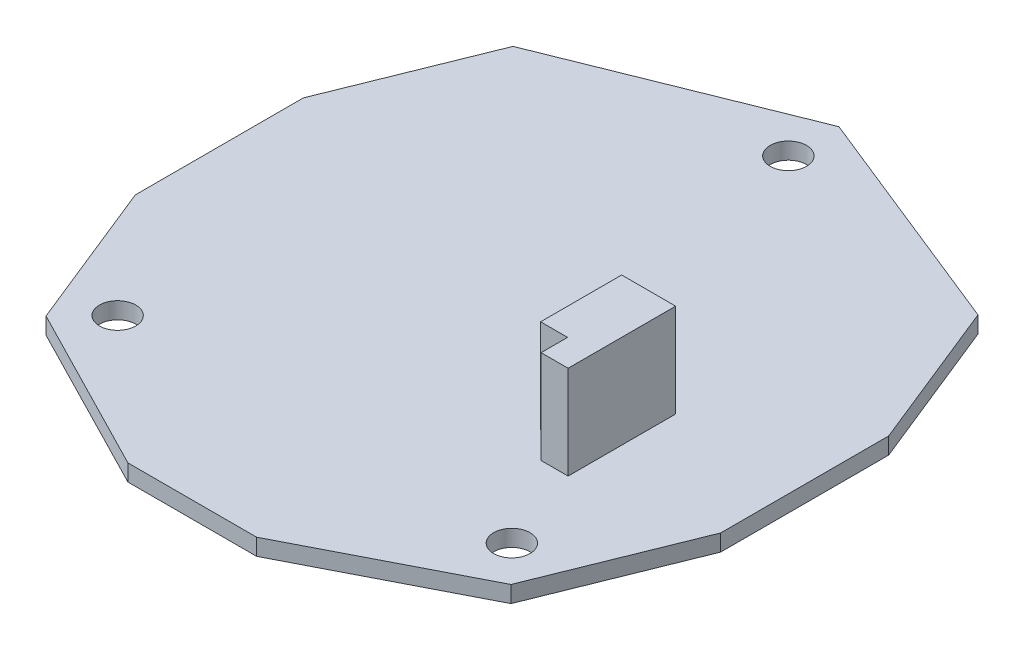
ISO-10303-21;
HEADER;
FILE_DESCRIPTION(('STEP AP214'),'2;1');
FILE_NAME('part.step','',(''),(''),'','','');
FILE_SCHEMA(('AUTOMOTIVE_DESIGN { 1 0 10303 214 1 1 1 1 }'));
ENDSEC;
DATA;
#1=APPLICATION_CONTEXT('core data for automotive mechanical design processes');
#2=APPLICATION_PROTOCOL_DEFINITION('international standard','automotive_design',2000,#1);
#3=PRODUCT_CONTEXT('',#1,'mechanical');
#4=PRODUCT('Part','Part','',(#3));
#5=PRODUCT_RELATED_PRODUCT_CATEGORY('part','',(#4));
#6=PRODUCT_DEFINITION_FORMATION('','',#4);
#7=PRODUCT_DEFINITION_CONTEXT('part definition',#1,'design');
#8=PRODUCT_DEFINITION('design','',#6,#7);
#9=PRODUCT_DEFINITION_SHAPE('','',#8);
#10=(LENGTH_UNIT() NAMED_UNIT(*) SI_UNIT(.MILLI.,.METRE.));
#11=(NAMED_UNIT(*) PLANE_ANGLE_UNIT() SI_UNIT($,.RADIAN.));
#12=(NAMED_UNIT(*) SI_UNIT($,.STERADIAN.) SOLID_ANGLE_UNIT());
#13=UNCERTAINTY_MEASURE_WITH_UNIT(LENGTH_MEASURE(1.E-05),#10,'distance_accuracy_value','');
#14=(GEOMETRIC_REPRESENTATION_CONTEXT(3) GLOBAL_UNCERTAINTY_ASSIGNED_CONTEXT((#13)) GLOBAL_UNIT_ASSIGNED_CONTEXT((#10,
#11,#12)) REPRESENTATION_CONTEXT('',''));
#15=CARTESIAN_POINT('',(0.,0.,0.));
#16=DIRECTION('',(0.,0.,1.));
#17=DIRECTION('',(1.,0.,0.));
#18=AXIS2_PLACEMENT_3D('',#15,#16,#17);
#19=CARTESIAN_POINT('',(0.,1.6,0.));
#20=DIRECTION('',(0.,-1.,0.));
#21=DIRECTION('',(0.,0.,-1.));
#22=AXIS2_PLACEMENT_3D('',#19,#20,#21);
#23=PLANE('',#22);
#24=DIRECTION('',(-0.373610843312482,0.,0.927585542017197));
#25=VECTOR('',#24,1.);
#26=CARTESIAN_POINT('',(-28.2,1.6,-7.74999999999999));
#27=LINE('',#26,#25);
#28=CARTESIAN_POINT('',(-22.4,1.6,-22.15));
#29=VERTEX_POINT('',#28);
#30=CARTESIAN_POINT('',(-28.2,1.6,-7.74999999999999));
#31=VERTEX_POINT('',#30);
#32=EDGE_CURVE('E196',#29,#31,#27,.T.);
#33=ORIENTED_EDGE('',*,*,#32,.T.);
#34=DIRECTION('',(0.,0.,1.));
#35=VECTOR('',#34,1.);
#36=CARTESIAN_POINT('',(-28.2,1.6,8.44000000000001));
#37=LINE('',#36,#35);
#38=CARTESIAN_POINT('',(-28.2,1.6,8.44000000000001));
#39=VERTEX_POINT('',#38);
#40=EDGE_CURVE('E199',#31,#39,#37,.T.);
#41=ORIENTED_EDGE('',*,*,#40,.T.);
#42=DIRECTION('',(0.373610843312482,0.,0.927585542017197));
#43=VECTOR('',#42,1.);
#44=CARTESIAN_POINT('',(-22.4,1.6,22.84));
#45=LINE('',#44,#43);
#46=CARTESIAN_POINT('',(-22.4,1.6,22.84));
#47=VERTEX_POINT('',#46);
#48=EDGE_CURVE('E202',#39,#47,#45,.T.);
#49=ORIENTED_EDGE('',*,*,#48,.T.);
#50=DIRECTION('',(0.889765992870365,0.,0.456417000046464));
#51=VECTOR('',#50,1.);
#52=CARTESIAN_POINT('',(-6.2,1.6,31.15));
#53=LINE('',#52,#51);
#54=CARTESIAN_POINT('',(-6.2,1.6,31.15));
#55=VERTEX_POINT('',#54);
#56=EDGE_CURVE('E204',#47,#55,#53,.T.);
#57=ORIENTED_EDGE('',*,*,#56,.T.);
#58=DIRECTION('',(1.,0.,0.));
#59=VECTOR('',#58,1.);
#60=CARTESIAN_POINT('',(6.2,1.6,31.15));
#61=LINE('',#60,#59);
#62=CARTESIAN_POINT('',(6.2,1.6,31.15));
#63=VERTEX_POINT('',#62);
#64=EDGE_CURVE('E206',#55,#63,#61,.T.);
#65=ORIENTED_EDGE('',*,*,#64,.T.);
#66=DIRECTION('',(0.889765992870365,0.,-0.456417000046464));
#67=VECTOR('',#66,1.);
#68=CARTESIAN_POINT('',(22.4,1.6,22.84));
#69=LINE('',#68,#67);
#70=CARTESIAN_POINT('',(22.4,1.6,22.84));
#71=VERTEX_POINT('',#70);
#72=EDGE_CURVE('E208',#63,#71,#69,.T.);
#73=ORIENTED_EDGE('',*,*,#72,.T.);
#74=DIRECTION('',(0.373610843312482,0.,-0.927585542017196));
#75=VECTOR('',#74,1.);
#76=CARTESIAN_POINT('',(28.2,1.6,8.44000000000001));
#77=LINE('',#76,#75);
#78=CARTESIAN_POINT('',(28.2,1.6,8.44000000000001));
#79=VERTEX_POINT('',#78);
#80=EDGE_CURVE('E210',#71,#79,#77,.T.);
#81=ORIENTED_EDGE('',*,*,#80,.T.);
#82=DIRECTION('',(0.,0.,-1.));
#83=VECTOR('',#82,1.);
#84=CARTESIAN_POINT('',(28.2,1.6,-7.74999999999999));
#85=LINE('',#84,#83);
#86=CARTESIAN_POINT('',(28.2,1.6,-7.74999999999999));
#87=VERTEX_POINT('',#86);
#88=EDGE_CURVE('E212',#79,#87,#85,.T.);
#89=ORIENTED_EDGE('',*,*,#88,.T.);
#90=DIRECTION('',(-0.373610843312482,0.,-0.927585542017197));
#91=VECTOR('',#90,1.);
#92=CARTESIAN_POINT('',(22.4,1.6,-22.15));
#93=LINE('',#92,#91);
#94=CARTESIAN_POINT('',(22.4,1.6,-22.15));
#95=VERTEX_POINT('',#94);
#96=EDGE_CURVE('E214',#87,#95,#93,.T.);
#97=ORIENTED_EDGE('',*,*,#96,.T.);
#98=DIRECTION('',(-0.927904222503089,0.,-0.372818660827134));
#99=VECTOR('',#98,1.);
#100=CARTESIAN_POINT('',(0.,1.6,-31.15));
#101=LINE('',#100,#99);
#102=CARTESIAN_POINT('',(0.,1.6,-31.15));
#103=VERTEX_POINT('',#102);
#104=EDGE_CURVE('E216',#95,#103,#101,.T.);
#105=ORIENTED_EDGE('',*,*,#104,.T.);
#106=DIRECTION('',(-0.927904222503089,0.,0.372818660827134));
#107=VECTOR('',#106,1.);
#108=CARTESIAN_POINT('',(-22.4,1.6,-22.15));
#109=LINE('',#108,#107);
#110=EDGE_CURVE('E218',#103,#29,#109,.T.);
#111=ORIENTED_EDGE('',*,*,#110,.T.);
#112=EDGE_LOOP('',(#33,#41,#49,#57,#65,#73,#81,#89,#97,#105,#111));
#113=FACE_BOUND('',#112,.T.);
#114=CARTESIAN_POINT('',(0.,1.6,-26.28));
#115=DIRECTION('',(0.,1.,0.));
#116=DIRECTION('',(0.,0.,1.));
#117=AXIS2_PLACEMENT_3D('',#114,#115,#116);
#118=CIRCLE('',#117,1.75);
#119=CARTESIAN_POINT('',(0.,1.6,-24.53));
#120=VERTEX_POINT('',#119);
#121=EDGE_CURVE('E187',#120,#120,#118,.T.);
#122=ORIENTED_EDGE('',*,*,#121,.F.);
#123=EDGE_LOOP('',(#122));
#124=FACE_BOUND('',#123,.T.);
#125=CARTESIAN_POINT('',(18.99,1.6,19.35));
#126=DIRECTION('',(0.,1.,0.));
#127=DIRECTION('',(0.,0.,1.));
#128=AXIS2_PLACEMENT_3D('',#125,#126,#127);
#129=CIRCLE('',#128,1.75);
#130=CARTESIAN_POINT('',(18.99,1.6,21.1));
#131=VERTEX_POINT('',#130);
#132=EDGE_CURVE('E182',#131,#131,#129,.T.);
#133=ORIENTED_EDGE('',*,*,#132,.F.);
#134=EDGE_LOOP('',(#133));
#135=FACE_BOUND('',#134,.T.);
#136=CARTESIAN_POINT('',(-18.99,1.6,19.35));
#137=DIRECTION('',(0.,1.,0.));
#138=DIRECTION('',(0.,0.,-1.));
#139=AXIS2_PLACEMENT_3D('',#136,#137,#138);
#140=CIRCLE('',#139,1.75);
#141=CARTESIAN_POINT('',(-18.99,1.6,17.6));
#142=VERTEX_POINT('',#141);
#143=EDGE_CURVE('E172',#142,#142,#140,.T.);
#144=ORIENTED_EDGE('',*,*,#143,.F.);
#145=EDGE_LOOP('',(#144));
#146=FACE_BOUND('',#145,.T.);
#147=DIRECTION('',(0.,0.,-1.));
#148=VECTOR('',#147,1.);
#149=CARTESIAN_POINT('',(16.11,1.6,11.05));
#150=LINE('',#149,#148);
#151=CARTESIAN_POINT('',(16.11,1.6,11.05));
#152=VERTEX_POINT('',#151);
#153=CARTESIAN_POINT('',(16.11,1.6,0.690000000000004));
#154=VERTEX_POINT('',#153);
#155=EDGE_CURVE('E171',#152,#154,#150,.T.);
#156=ORIENTED_EDGE('',*,*,#155,.F.);
#157=DIRECTION('',(1.,0.,0.));
#158=VECTOR('',#157,1.);
#159=CARTESIAN_POINT('',(16.11,1.6,11.05));
#160=LINE('',#159,#158);
#161=CARTESIAN_POINT('',(13.51,1.6,11.05));
#162=VERTEX_POINT('',#161);
#163=EDGE_CURVE('E168',#162,#152,#160,.T.);
#164=ORIENTED_EDGE('',*,*,#163,.F.);
#165=DIRECTION('',(0.,0.,1.));
#166=VECTOR('',#165,1.);
#167=CARTESIAN_POINT('',(13.51,1.6,8.5));
#168=LINE('',#167,#166);
#169=CARTESIAN_POINT('',(13.51,1.6,8.5));
#170=VERTEX_POINT('',#169);
#171=EDGE_CURVE('E530',#170,#162,#168,.T.);
#172=ORIENTED_EDGE('',*,*,#171,.F.);
#173=DIRECTION('',(1.,0.,0.));
#174=VECTOR('',#173,1.);
#175=CARTESIAN_POINT('',(13.51,1.6,8.5));
#176=LINE('',#175,#174);
#177=CARTESIAN_POINT('',(10.91,1.6,8.5));
#178=VERTEX_POINT('',#177);
#179=EDGE_CURVE('E545',#178,#170,#176,.T.);
#180=ORIENTED_EDGE('',*,*,#179,.F.);
#181=DIRECTION('',(0.,0.,1.));
#182=VECTOR('',#181,1.);
#183=CARTESIAN_POINT('',(10.91,1.6,0.690000000000005));
#184=LINE('',#183,#182);
#185=CARTESIAN_POINT('',(10.91,1.6,0.690000000000005));
#186=VERTEX_POINT('',#185);
#187=EDGE_CURVE('E52',#186,#178,#184,.T.);
#188=ORIENTED_EDGE('',*,*,#187,.F.);
#189=DIRECTION('',(-1.,0.,0.));
#190=VECTOR('',#189,1.);
#191=CARTESIAN_POINT('',(13.51,1.6,0.690000000000005));
#192=LINE('',#191,#190);
#193=EDGE_CURVE('E47',#154,#186,#192,.T.);
#194=ORIENTED_EDGE('',*,*,#193,.F.);
#195=EDGE_LOOP('',(#156,#164,#172,#180,#188,#194));
#196=FACE_BOUND('',#195,.T.);
#197=ADVANCED_FACE('F32',(#113,#124,#135,#146,#196),#23,.F.);
#198=CARTESIAN_POINT('',(-28.2,1.6,-7.74999999999999));
#199=DIRECTION('',(0.927585542017197,0.,0.373610843312482));
#200=DIRECTION('',(0.373610843312482,0.,-0.927585542017197));
#201=AXIS2_PLACEMENT_3D('',#198,#199,#200);
#202=PLANE('',#201);
#203=DIRECTION('',(-0.373610843312482,0.,0.927585542017197));
#204=VECTOR('',#203,1.);
#205=CARTESIAN_POINT('',(-28.2,0.,-7.74999999999999));
#206=LINE('',#205,#204);
#207=CARTESIAN_POINT('',(-22.4,0.,-22.15));
#208=VERTEX_POINT('',#207);
#209=CARTESIAN_POINT('',(-28.2,0.,-7.74999999999999));
#210=VERTEX_POINT('',#209);
#211=EDGE_CURVE('E193',#208,#210,#206,.T.);
#212=ORIENTED_EDGE('',*,*,#211,.T.);
#213=DIRECTION('',(0.,-1.,0.));
#214=VECTOR('',#213,1.);
#215=CARTESIAN_POINT('',(-28.2,1.6,-7.74999999999999));
#216=LINE('',#215,#214);
#217=EDGE_CURVE('E11',#31,#210,#216,.T.);
#218=ORIENTED_EDGE('',*,*,#217,.F.);
#219=ORIENTED_EDGE('',*,*,#32,.F.);
#220=DIRECTION('',(0.,-1.,0.));
#221=VECTOR('',#220,1.);
#222=CARTESIAN_POINT('',(-22.4,1.6,-22.15));
#223=LINE('',#222,#221);
#224=EDGE_CURVE('E220',#29,#208,#223,.T.);
#225=ORIENTED_EDGE('',*,*,#224,.T.);
#226=EDGE_LOOP('',(#212,#218,#219,#225));
#227=FACE_BOUND('',#226,.T.);
#228=ADVANCED_FACE('F34',(#227),#202,.F.);
#229=CARTESIAN_POINT('',(-28.2,1.6,8.44000000000001));
#230=DIRECTION('',(1.,0.,0.));
#231=DIRECTION('',(0.,0.,-1.));
#232=AXIS2_PLACEMENT_3D('',#229,#230,#231);
#233=PLANE('',#232);
#234=DIRECTION('',(0.,0.,1.));
#235=VECTOR('',#234,1.);
#236=CARTESIAN_POINT('',(-28.2,0.,8.44000000000001));
#237=LINE('',#236,#235);
#238=CARTESIAN_POINT('',(-28.2,0.,8.44000000000001));
#239=VERTEX_POINT('',#238);
#240=EDGE_CURVE('E223',#210,#239,#237,.T.);
#241=ORIENTED_EDGE('',*,*,#240,.T.);
#242=DIRECTION('',(0.,-1.,0.));
#243=VECTOR('',#242,1.);
#244=CARTESIAN_POINT('',(-28.2,1.6,8.44000000000001));
#245=LINE('',#244,#243);
#246=EDGE_CURVE('E40',#39,#239,#245,.T.);
#247=ORIENTED_EDGE('',*,*,#246,.F.);
#248=ORIENTED_EDGE('',*,*,#40,.F.);
#249=ORIENTED_EDGE('',*,*,#217,.T.);
#250=EDGE_LOOP('',(#241,#247,#248,#249));
#251=FACE_BOUND('',#250,.T.);
#252=ADVANCED_FACE('F295',(#251),#233,.F.);
#253=CARTESIAN_POINT('',(-22.4,1.6,22.84));
#254=DIRECTION('',(0.927585542017197,0.,-0.373610843312482));
#255=DIRECTION('',(-0.373610843312482,0.,-0.927585542017197));
#256=AXIS2_PLACEMENT_3D('',#253,#254,#255);
#257=PLANE('',#256);
#258=DIRECTION('',(0.373610843312482,0.,0.927585542017197));
#259=VECTOR('',#258,1.);
#260=CARTESIAN_POINT('',(-22.4,0.,22.84));
#261=LINE('',#260,#259);
#262=CARTESIAN_POINT('',(-22.4,0.,22.84));
#263=VERTEX_POINT('',#262);
#264=EDGE_CURVE('E225',#239,#263,#261,.T.);
#265=ORIENTED_EDGE('',*,*,#264,.T.);
#266=DIRECTION('',(0.,-1.,0.));
#267=VECTOR('',#266,1.);
#268=CARTESIAN_POINT('',(-22.4,1.6,22.84));
#269=LINE('',#268,#267);
#270=EDGE_CURVE('E265',#47,#263,#269,.T.);
#271=ORIENTED_EDGE('',*,*,#270,.F.);
#272=ORIENTED_EDGE('',*,*,#48,.F.);
#273=ORIENTED_EDGE('',*,*,#246,.T.);
#274=EDGE_LOOP('',(#265,#271,#272,#273));
#275=FACE_BOUND('',#274,.T.);
#276=ADVANCED_FACE('F272',(#275),#257,.F.);
#277=CARTESIAN_POINT('',(-6.2,1.6,31.15));
#278=DIRECTION('',(0.456417000046464,0.,-0.889765992870365));
#279=DIRECTION('',(-0.889765992870365,0.,-0.456417000046464));
#280=AXIS2_PLACEMENT_3D('',#277,#278,#279);
#281=PLANE('',#280);
#282=DIRECTION('',(0.889765992870365,0.,0.456417000046464));
#283=VECTOR('',#282,1.);
#284=CARTESIAN_POINT('',(-6.2,0.,31.15));
#285=LINE('',#284,#283);
#286=CARTESIAN_POINT('',(-6.2,0.,31.15));
#287=VERTEX_POINT('',#286);
#288=EDGE_CURVE('E227',#263,#287,#285,.T.);
#289=ORIENTED_EDGE('',*,*,#288,.T.);
#290=DIRECTION('',(0.,-1.,0.));
#291=VECTOR('',#290,1.);
#292=CARTESIAN_POINT('',(-6.2,1.6,31.15));
#293=LINE('',#292,#291);
#294=EDGE_CURVE('E262',#55,#287,#293,.T.);
#295=ORIENTED_EDGE('',*,*,#294,.F.);
#296=ORIENTED_EDGE('',*,*,#56,.F.);
#297=ORIENTED_EDGE('',*,*,#270,.T.);
#298=EDGE_LOOP('',(#289,#295,#296,#297));
#299=FACE_BOUND('',#298,.T.);
#300=ADVANCED_FACE('F283',(#299),#281,.F.);
#301=CARTESIAN_POINT('',(6.2,1.6,31.15));
#302=DIRECTION('',(0.,0.,-1.));
#303=DIRECTION('',(-1.,0.,0.));
#304=AXIS2_PLACEMENT_3D('',#301,#302,#303);
#305=PLANE('',#304);
#306=DIRECTION('',(1.,0.,0.));
#307=VECTOR('',#306,1.);
#308=CARTESIAN_POINT('',(6.2,0.,31.15));
#309=LINE('',#308,#307);
#310=CARTESIAN_POINT('',(6.2,0.,31.15));
#311=VERTEX_POINT('',#310);
#312=EDGE_CURVE('E229',#287,#311,#309,.T.);
#313=ORIENTED_EDGE('',*,*,#312,.T.);
#314=DIRECTION('',(0.,-1.,0.));
#315=VECTOR('',#314,1.);
#316=CARTESIAN_POINT('',(6.2,1.6,31.15));
#317=LINE('',#316,#315);
#318=EDGE_CURVE('E259',#63,#311,#317,.T.);
#319=ORIENTED_EDGE('',*,*,#318,.F.);
#320=ORIENTED_EDGE('',*,*,#64,.F.);
#321=ORIENTED_EDGE('',*,*,#294,.T.);
#322=EDGE_LOOP('',(#313,#319,#320,#321));
#323=FACE_BOUND('',#322,.T.);
#324=ADVANCED_FACE('F287',(#323),#305,.F.);
#325=CARTESIAN_POINT('',(22.4,1.6,22.84));
#326=DIRECTION('',(-0.456417000046465,0.,-0.889765992870365));
#327=DIRECTION('',(-0.889765992870365,0.,0.456417000046465));
#328=AXIS2_PLACEMENT_3D('',#325,#326,#327);
#329=PLANE('',#328);
#330=DIRECTION('',(0.889765992870365,0.,-0.456417000046464));
#331=VECTOR('',#330,1.);
#332=CARTESIAN_POINT('',(22.4,0.,22.84));
#333=LINE('',#332,#331);
#334=CARTESIAN_POINT('',(22.4,0.,22.84));
#335=VERTEX_POINT('',#334);
#336=EDGE_CURVE('E231',#311,#335,#333,.T.);
#337=ORIENTED_EDGE('',*,*,#336,.T.);
#338=DIRECTION('',(0.,-1.,0.));
#339=VECTOR('',#338,1.);
#340=CARTESIAN_POINT('',(22.4,1.6,22.84));
#341=LINE('',#340,#339);
#342=EDGE_CURVE('E256',#71,#335,#341,.T.);
#343=ORIENTED_EDGE('',*,*,#342,.F.);
#344=ORIENTED_EDGE('',*,*,#72,.F.);
#345=ORIENTED_EDGE('',*,*,#318,.T.);
#346=EDGE_LOOP('',(#337,#343,#344,#345));
#347=FACE_BOUND('',#346,.T.);
#348=ADVANCED_FACE('F323',(#347),#329,.F.);
#349=CARTESIAN_POINT('',(28.2,1.6,8.44000000000001));
#350=DIRECTION('',(-0.927585542017196,0.,-0.373610843312482));
#351=DIRECTION('',(-0.373610843312482,0.,0.927585542017196));
#352=AXIS2_PLACEMENT_3D('',#349,#350,#351);
#353=PLANE('',#352);
#354=DIRECTION('',(0.373610843312482,0.,-0.927585542017196));
#355=VECTOR('',#354,1.);
#356=CARTESIAN_POINT('',(28.2,0.,8.44000000000001));
#357=LINE('',#356,#355);
#358=CARTESIAN_POINT('',(28.2,0.,8.44000000000001));
#359=VERTEX_POINT('',#358);
#360=EDGE_CURVE('E233',#335,#359,#357,.T.);
#361=ORIENTED_EDGE('',*,*,#360,.T.);
#362=DIRECTION('',(0.,-1.,0.));
#363=VECTOR('',#362,1.);
#364=CARTESIAN_POINT('',(28.2,1.6,8.44000000000001));
#365=LINE('',#364,#363);
#366=EDGE_CURVE('E253',#79,#359,#365,.T.);
#367=ORIENTED_EDGE('',*,*,#366,.F.);
#368=ORIENTED_EDGE('',*,*,#80,.F.);
#369=ORIENTED_EDGE('',*,*,#342,.T.);
#370=EDGE_LOOP('',(#361,#367,#368,#369));
#371=FACE_BOUND('',#370,.T.);
#372=ADVANCED_FACE('F321',(#371),#353,.F.);
#373=CARTESIAN_POINT('',(28.2,1.6,-7.74999999999999));
#374=DIRECTION('',(-1.,0.,0.));
#375=DIRECTION('',(0.,0.,1.));
#376=AXIS2_PLACEMENT_3D('',#373,#374,#375);
#377=PLANE('',#376);
#378=DIRECTION('',(0.,0.,-1.));
#379=VECTOR('',#378,1.);
#380=CARTESIAN_POINT('',(28.2,0.,-7.74999999999999));
#381=LINE('',#380,#379);
#382=CARTESIAN_POINT('',(28.2,0.,-7.74999999999999));
#383=VERTEX_POINT('',#382);
#384=EDGE_CURVE('E235',#359,#383,#381,.T.);
#385=ORIENTED_EDGE('',*,*,#384,.T.);
#386=DIRECTION('',(0.,-1.,0.));
#387=VECTOR('',#386,1.);
#388=CARTESIAN_POINT('',(28.2,1.6,-7.74999999999999));
#389=LINE('',#388,#387);
#390=EDGE_CURVE('E250',#87,#383,#389,.T.);
#391=ORIENTED_EDGE('',*,*,#390,.F.);
#392=ORIENTED_EDGE('',*,*,#88,.F.);
#393=ORIENTED_EDGE('',*,*,#366,.T.);
#394=EDGE_LOOP('',(#385,#391,#392,#393));
#395=FACE_BOUND('',#394,.T.);
#396=ADVANCED_FACE('F316',(#395),#377,.F.);
#397=CARTESIAN_POINT('',(22.4,1.6,-22.15));
#398=DIRECTION('',(-0.927585542017197,0.,0.373610843312482));
#399=DIRECTION('',(0.373610843312482,0.,0.927585542017197));
#400=AXIS2_PLACEMENT_3D('',#397,#398,#399);
#401=PLANE('',#400);
#402=DIRECTION('',(-0.373610843312482,0.,-0.927585542017197));
#403=VECTOR('',#402,1.);
#404=CARTESIAN_POINT('',(22.4,0.,-22.15));
#405=LINE('',#404,#403);
#406=CARTESIAN_POINT('',(22.4,0.,-22.15));
#407=VERTEX_POINT('',#406);
#408=EDGE_CURVE('E237',#383,#407,#405,.T.);
#409=ORIENTED_EDGE('',*,*,#408,.T.);
#410=DIRECTION('',(0.,-1.,0.));
#411=VECTOR('',#410,1.);
#412=CARTESIAN_POINT('',(22.4,1.6,-22.15));
#413=LINE('',#412,#411);
#414=EDGE_CURVE('E247',#95,#407,#413,.T.);
#415=ORIENTED_EDGE('',*,*,#414,.F.);
#416=ORIENTED_EDGE('',*,*,#96,.F.);
#417=ORIENTED_EDGE('',*,*,#390,.T.);
#418=EDGE_LOOP('',(#409,#415,#416,#417));
#419=FACE_BOUND('',#418,.T.);
#420=ADVANCED_FACE('F311',(#419),#401,.F.);
#421=CARTESIAN_POINT('',(0.,1.6,-31.15));
#422=DIRECTION('',(-0.372818660827134,0.,0.927904222503089));
#423=DIRECTION('',(0.927904222503089,0.,0.372818660827134));
#424=AXIS2_PLACEMENT_3D('',#421,#422,#423);
#425=PLANE('',#424);
#426=DIRECTION('',(-0.927904222503089,0.,-0.372818660827134));
#427=VECTOR('',#426,1.);
#428=CARTESIAN_POINT('',(0.,0.,-31.15));
#429=LINE('',#428,#427);
#430=CARTESIAN_POINT('',(0.,0.,-31.15));
#431=VERTEX_POINT('',#430);
#432=EDGE_CURVE('E239',#407,#431,#429,.T.);
#433=ORIENTED_EDGE('',*,*,#432,.T.);
#434=DIRECTION('',(0.,-1.,0.));
#435=VECTOR('',#434,1.);
#436=CARTESIAN_POINT('',(0.,1.6,-31.15));
#437=LINE('',#436,#435);
#438=EDGE_CURVE('E244',#103,#431,#437,.T.);
#439=ORIENTED_EDGE('',*,*,#438,.F.);
#440=ORIENTED_EDGE('',*,*,#104,.F.);
#441=ORIENTED_EDGE('',*,*,#414,.T.);
#442=EDGE_LOOP('',(#433,#439,#440,#441));
#443=FACE_BOUND('',#442,.T.);
#444=ADVANCED_FACE('F307',(#443),#425,.F.);
#445=CARTESIAN_POINT('',(-22.4,1.6,-22.15));
#446=DIRECTION('',(0.372818660827134,0.,0.927904222503089));
#447=DIRECTION('',(0.927904222503089,0.,-0.372818660827134));
#448=AXIS2_PLACEMENT_3D('',#445,#446,#447);
#449=PLANE('',#448);
#450=DIRECTION('',(-0.927904222503089,0.,0.372818660827134));
#451=VECTOR('',#450,1.);
#452=CARTESIAN_POINT('',(-22.4,0.,-22.15));
#453=LINE('',#452,#451);
#454=EDGE_CURVE('E200',#431,#208,#453,.T.);
#455=ORIENTED_EDGE('',*,*,#454,.T.);
#456=ORIENTED_EDGE('',*,*,#224,.F.);
#457=ORIENTED_EDGE('',*,*,#110,.F.);
#458=ORIENTED_EDGE('',*,*,#438,.T.);
#459=EDGE_LOOP('',(#455,#456,#457,#458));
#460=FACE_BOUND('',#459,.T.);
#461=ADVANCED_FACE('F302',(#460),#449,.F.);
#462=CARTESIAN_POINT('',(0.,0.,0.));
#463=DIRECTION('',(0.,-1.,0.));
#464=DIRECTION('',(0.,0.,-1.));
#465=AXIS2_PLACEMENT_3D('',#462,#463,#464);
#466=PLANE('',#465);
#467=CARTESIAN_POINT('',(-18.99,0.,19.35));
#468=DIRECTION('',(0.,1.,0.));
#469=DIRECTION('',(0.,0.,-1.));
#470=AXIS2_PLACEMENT_3D('',#467,#468,#469);
#471=CIRCLE('',#470,1.75);
#472=CARTESIAN_POINT('',(-18.99,0.,17.6));
#473=VERTEX_POINT('',#472);
#474=EDGE_CURVE('E175',#473,#473,#471,.T.);
#475=ORIENTED_EDGE('',*,*,#474,.T.);
#476=EDGE_LOOP('',(#475));
#477=FACE_BOUND('',#476,.T.);
#478=CARTESIAN_POINT('',(18.99,0.,19.35));
#479=DIRECTION('',(0.,1.,0.));
#480=DIRECTION('',(0.,0.,1.));
#481=AXIS2_PLACEMENT_3D('',#478,#479,#480);
#482=CIRCLE('',#481,1.75);
#483=CARTESIAN_POINT('',(18.99,0.,21.1));
#484=VERTEX_POINT('',#483);
#485=EDGE_CURVE('E184',#484,#484,#482,.T.);
#486=ORIENTED_EDGE('',*,*,#485,.T.);
#487=EDGE_LOOP('',(#486));
#488=FACE_BOUND('',#487,.T.);
#489=CARTESIAN_POINT('',(0.,0.,-26.28));
#490=DIRECTION('',(0.,1.,0.));
#491=DIRECTION('',(0.,0.,1.));
#492=AXIS2_PLACEMENT_3D('',#489,#490,#491);
#493=CIRCLE('',#492,1.75);
#494=CARTESIAN_POINT('',(0.,0.,-24.53));
#495=VERTEX_POINT('',#494);
#496=EDGE_CURVE('E190',#495,#495,#493,.T.);
#497=ORIENTED_EDGE('',*,*,#496,.T.);
#498=EDGE_LOOP('',(#497));
#499=FACE_BOUND('',#498,.T.);
#500=ORIENTED_EDGE('',*,*,#211,.F.);
#501=ORIENTED_EDGE('',*,*,#454,.F.);
#502=ORIENTED_EDGE('',*,*,#432,.F.);
#503=ORIENTED_EDGE('',*,*,#408,.F.);
#504=ORIENTED_EDGE('',*,*,#384,.F.);
#505=ORIENTED_EDGE('',*,*,#360,.F.);
#506=ORIENTED_EDGE('',*,*,#336,.F.);
#507=ORIENTED_EDGE('',*,*,#312,.F.);
#508=ORIENTED_EDGE('',*,*,#288,.F.);
#509=ORIENTED_EDGE('',*,*,#264,.F.);
#510=ORIENTED_EDGE('',*,*,#240,.F.);
#511=EDGE_LOOP('',(#500,#501,#502,#503,#504,#505,#506,#507,#508,#509,#510));
#512=FACE_BOUND('',#511,.T.);
#513=ADVANCED_FACE('F278',(#477,#488,#499,#512),#466,.T.);
#514=CARTESIAN_POINT('',(0.,0.,-26.28));
#515=DIRECTION('',(0.,1.,0.));
#516=DIRECTION('',(0.,0.,1.));
#517=AXIS2_PLACEMENT_3D('',#514,#515,#516);
#518=CYLINDRICAL_SURFACE('',#517,1.75);
#519=ORIENTED_EDGE('',*,*,#496,.F.);
#520=EDGE_LOOP('',(#519));
#521=FACE_BOUND('',#520,.T.);
#522=ORIENTED_EDGE('',*,*,#121,.T.);
#523=EDGE_LOOP('',(#522));
#524=FACE_BOUND('',#523,.T.);
#525=ADVANCED_FACE('F339',(#521,#524),#518,.F.);
#526=CARTESIAN_POINT('',(18.99,0.,19.35));
#527=DIRECTION('',(0.,1.,0.));
#528=DIRECTION('',(0.,0.,1.));
#529=AXIS2_PLACEMENT_3D('',#526,#527,#528);
#530=CYLINDRICAL_SURFACE('',#529,1.75);
#531=ORIENTED_EDGE('',*,*,#485,.F.);
#532=EDGE_LOOP('',(#531));
#533=FACE_BOUND('',#532,.T.);
#534=ORIENTED_EDGE('',*,*,#132,.T.);
#535=EDGE_LOOP('',(#534));
#536=FACE_BOUND('',#535,.T.);
#537=ADVANCED_FACE('F377',(#533,#536),#530,.F.);
#538=CARTESIAN_POINT('',(-18.99,0.,19.35));
#539=DIRECTION('',(0.,1.,0.));
#540=DIRECTION('',(0.,0.,1.));
#541=AXIS2_PLACEMENT_3D('',#538,#539,#540);
#542=CYLINDRICAL_SURFACE('',#541,1.75);
#543=ORIENTED_EDGE('',*,*,#474,.F.);
#544=EDGE_LOOP('',(#543));
#545=FACE_BOUND('',#544,.T.);
#546=ORIENTED_EDGE('',*,*,#143,.T.);
#547=EDGE_LOOP('',(#546));
#548=FACE_BOUND('',#547,.T.);
#549=ADVANCED_FACE('F384',(#545,#548),#542,.F.);
#550=CARTESIAN_POINT('',(16.11,10.6,11.05));
#551=DIRECTION('',(-1.,0.,0.));
#552=DIRECTION('',(0.,0.,1.));
#553=AXIS2_PLACEMENT_3D('',#550,#551,#552);
#554=PLANE('',#553);
#555=ORIENTED_EDGE('',*,*,#155,.T.);
#556=DIRECTION('',(0.,-1.,0.));
#557=VECTOR('',#556,1.);
#558=CARTESIAN_POINT('',(16.11,10.6,0.690000000000005));
#559=LINE('',#558,#557);
#560=CARTESIAN_POINT('',(16.11,10.6,0.690000000000005));
#561=VERTEX_POINT('',#560);
#562=EDGE_CURVE('E152',#561,#154,#559,.T.);
#563=ORIENTED_EDGE('',*,*,#562,.F.);
#564=DIRECTION('',(0.,0.,-1.));
#565=VECTOR('',#564,1.);
#566=CARTESIAN_POINT('',(16.11,10.6,11.05));
#567=LINE('',#566,#565);
#568=CARTESIAN_POINT('',(16.11,10.6,11.05));
#569=VERTEX_POINT('',#568);
#570=EDGE_CURVE('E159',#569,#561,#567,.T.);
#571=ORIENTED_EDGE('',*,*,#570,.F.);
#572=DIRECTION('',(0.,-1.,0.));
#573=VECTOR('',#572,1.);
#574=CARTESIAN_POINT('',(16.11,10.6,11.05));
#575=LINE('',#574,#573);
#576=EDGE_CURVE('E526',#569,#152,#575,.T.);
#577=ORIENTED_EDGE('',*,*,#576,.T.);
#578=EDGE_LOOP('',(#555,#563,#571,#577));
#579=FACE_BOUND('',#578,.T.);
#580=ADVANCED_FACE('F170',(#579),#554,.F.);
#581=CARTESIAN_POINT('',(13.51,10.6,0.690000000000005));
#582=DIRECTION('',(0.,0.,1.));
#583=DIRECTION('',(1.,0.,0.));
#584=AXIS2_PLACEMENT_3D('',#581,#582,#583);
#585=PLANE('',#584);
#586=ORIENTED_EDGE('',*,*,#193,.T.);
#587=DIRECTION('',(0.,-1.,0.));
#588=VECTOR('',#587,1.);
#589=CARTESIAN_POINT('',(10.91,10.6,0.690000000000005));
#590=LINE('',#589,#588);
#591=CARTESIAN_POINT('',(10.91,10.6,0.690000000000005));
#592=VERTEX_POINT('',#591);
#593=EDGE_CURVE('E155',#592,#186,#590,.T.);
#594=ORIENTED_EDGE('',*,*,#593,.F.);
#595=DIRECTION('',(-1.,0.,0.));
#596=VECTOR('',#595,1.);
#597=CARTESIAN_POINT('',(16.11,10.6,0.690000000000005));
#598=LINE('',#597,#596);
#599=EDGE_CURVE('E148',#561,#592,#598,.T.);
#600=ORIENTED_EDGE('',*,*,#599,.F.);
#601=ORIENTED_EDGE('',*,*,#562,.T.);
#602=EDGE_LOOP('',(#586,#594,#600,#601));
#603=FACE_BOUND('',#602,.T.);
#604=ADVANCED_FACE('F150',(#603),#585,.F.);
#605=CARTESIAN_POINT('',(10.91,10.6,0.690000000000005));
#606=DIRECTION('',(1.,0.,0.));
#607=DIRECTION('',(0.,0.,-1.));
#608=AXIS2_PLACEMENT_3D('',#605,#606,#607);
#609=PLANE('',#608);
#610=ORIENTED_EDGE('',*,*,#187,.T.);
#611=DIRECTION('',(0.,-1.,0.));
#612=VECTOR('',#611,1.);
#613=CARTESIAN_POINT('',(10.91,10.6,8.5));
#614=LINE('',#613,#612);
#615=CARTESIAN_POINT('',(10.91,10.6,8.5));
#616=VERTEX_POINT('',#615);
#617=EDGE_CURVE('E177',#616,#178,#614,.T.);
#618=ORIENTED_EDGE('',*,*,#617,.F.);
#619=DIRECTION('',(0.,0.,1.));
#620=VECTOR('',#619,1.);
#621=CARTESIAN_POINT('',(10.91,10.6,0.690000000000005));
#622=LINE('',#621,#620);
#623=EDGE_CURVE('E158',#592,#616,#622,.T.);
#624=ORIENTED_EDGE('',*,*,#623,.F.);
#625=ORIENTED_EDGE('',*,*,#593,.T.);
#626=EDGE_LOOP('',(#610,#618,#624,#625));
#627=FACE_BOUND('',#626,.T.);
#628=ADVANCED_FACE('F404',(#627),#609,.F.);
#629=CARTESIAN_POINT('',(13.51,10.6,8.5));
#630=DIRECTION('',(0.,0.,-1.));
#631=DIRECTION('',(-1.,0.,0.));
#632=AXIS2_PLACEMENT_3D('',#629,#630,#631);
#633=PLANE('',#632);
#634=ORIENTED_EDGE('',*,*,#179,.T.);
#635=DIRECTION('',(0.,-1.,0.));
#636=VECTOR('',#635,1.);
#637=CARTESIAN_POINT('',(13.51,10.6,8.5));
#638=LINE('',#637,#636);
#639=CARTESIAN_POINT('',(13.51,10.6,8.5));
#640=VERTEX_POINT('',#639);
#641=EDGE_CURVE('E533',#640,#170,#638,.T.);
#642=ORIENTED_EDGE('',*,*,#641,.F.);
#643=DIRECTION('',(1.,0.,0.));
#644=VECTOR('',#643,1.);
#645=CARTESIAN_POINT('',(13.51,10.6,8.5));
#646=LINE('',#645,#644);
#647=EDGE_CURVE('E546',#616,#640,#646,.T.);
#648=ORIENTED_EDGE('',*,*,#647,.F.);
#649=ORIENTED_EDGE('',*,*,#617,.T.);
#650=EDGE_LOOP('',(#634,#642,#648,#649));
#651=FACE_BOUND('',#650,.T.);
#652=ADVANCED_FACE('F411',(#651),#633,.F.);
#653=CARTESIAN_POINT('',(13.51,10.6,8.5));
#654=DIRECTION('',(1.,0.,0.));
#655=DIRECTION('',(0.,0.,-1.));
#656=AXIS2_PLACEMENT_3D('',#653,#654,#655);
#657=PLANE('',#656);
#658=ORIENTED_EDGE('',*,*,#171,.T.);
#659=DIRECTION('',(0.,-1.,0.));
#660=VECTOR('',#659,1.);
#661=CARTESIAN_POINT('',(13.51,10.6,11.05));
#662=LINE('',#661,#660);
#663=CARTESIAN_POINT('',(13.51,10.6,11.05));
#664=VERTEX_POINT('',#663);
#665=EDGE_CURVE('E528',#664,#162,#662,.T.);
#666=ORIENTED_EDGE('',*,*,#665,.F.);
#667=DIRECTION('',(0.,0.,1.));
#668=VECTOR('',#667,1.);
#669=CARTESIAN_POINT('',(13.51,10.6,8.5));
#670=LINE('',#669,#668);
#671=EDGE_CURVE('E535',#640,#664,#670,.T.);
#672=ORIENTED_EDGE('',*,*,#671,.F.);
#673=ORIENTED_EDGE('',*,*,#641,.T.);
#674=EDGE_LOOP('',(#658,#666,#672,#673));
#675=FACE_BOUND('',#674,.T.);
#676=ADVANCED_FACE('F419',(#675),#657,.F.);
#677=CARTESIAN_POINT('',(16.11,10.6,11.05));
#678=DIRECTION('',(0.,0.,-1.));
#679=DIRECTION('',(-1.,0.,0.));
#680=AXIS2_PLACEMENT_3D('',#677,#678,#679);
#681=PLANE('',#680);
#682=ORIENTED_EDGE('',*,*,#163,.T.);
#683=ORIENTED_EDGE('',*,*,#576,.F.);
#684=DIRECTION('',(1.,0.,0.));
#685=VECTOR('',#684,1.);
#686=CARTESIAN_POINT('',(16.11,10.6,11.05));
#687=LINE('',#686,#685);
#688=EDGE_CURVE('E164',#664,#569,#687,.T.);
#689=ORIENTED_EDGE('',*,*,#688,.F.);
#690=ORIENTED_EDGE('',*,*,#665,.T.);
#691=EDGE_LOOP('',(#682,#683,#689,#690));
#692=FACE_BOUND('',#691,.T.);
#693=ADVANCED_FACE('F427',(#692),#681,.F.);
#694=CARTESIAN_POINT('',(0.,10.6,0.));
#695=DIRECTION('',(0.,1.,0.));
#696=DIRECTION('',(0.,0.,1.));
#697=AXIS2_PLACEMENT_3D('',#694,#695,#696);
#698=PLANE('',#697);
#699=ORIENTED_EDGE('',*,*,#570,.T.);
#700=ORIENTED_EDGE('',*,*,#599,.T.);
#701=ORIENTED_EDGE('',*,*,#623,.T.);
#702=ORIENTED_EDGE('',*,*,#647,.T.);
#703=ORIENTED_EDGE('',*,*,#671,.T.);
#704=ORIENTED_EDGE('',*,*,#688,.T.);
#705=EDGE_LOOP('',(#699,#700,#701,#702,#703,#704));
#706=FACE_BOUND('',#705,.T.);
#707=ADVANCED_FACE('F162',(#706),#698,.T.);
#708=CLOSED_SHELL('',(#197,#228,#252,#276,#300,#324,#348,#372,#396,#420,#444,#461,#513,#525,
#537,#549,#580,#604,#628,#652,#676,#693,#707));
#709=MANIFOLD_SOLID_BREP('B2',#708);
#710=ADVANCED_BREP_SHAPE_REPRESENTATION('',(#18,#709),#14);
#711=SHAPE_DEFINITION_REPRESENTATION(#9,#710);
ENDSEC;
END-ISO-10303-21;
